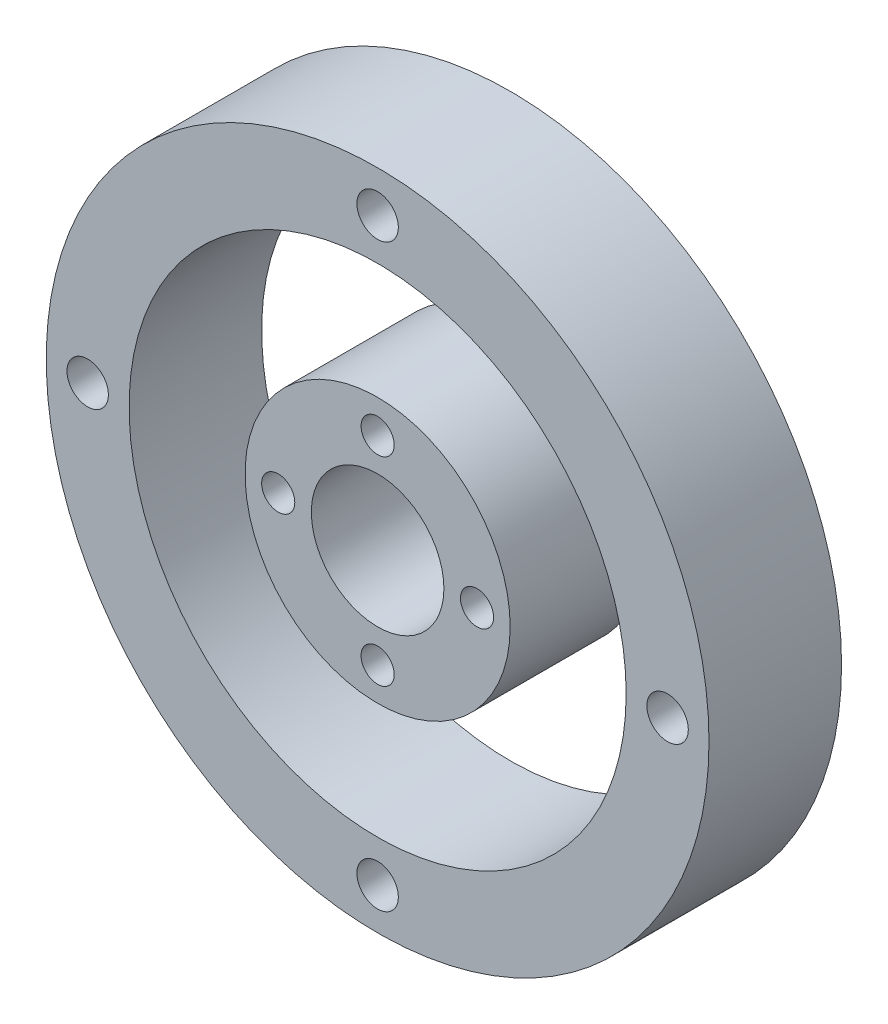
ISO-10303-21;
HEADER;
FILE_DESCRIPTION(('STEP AP214'),'2;1');
FILE_NAME('part.step','',(''),(''),'','','');
FILE_SCHEMA(('AUTOMOTIVE_DESIGN { 1 0 10303 214 1 1 1 1 }'));
ENDSEC;
DATA;
#1=APPLICATION_CONTEXT('core data for automotive mechanical design processes');
#2=APPLICATION_PROTOCOL_DEFINITION('international standard','automotive_design',2000,#1);
#3=PRODUCT_CONTEXT('',#1,'mechanical');
#4=PRODUCT('Part','Part','',(#3));
#5=PRODUCT_RELATED_PRODUCT_CATEGORY('part','',(#4));
#6=PRODUCT_DEFINITION_FORMATION('','',#4);
#7=PRODUCT_DEFINITION_CONTEXT('part definition',#1,'design');
#8=PRODUCT_DEFINITION('design','',#6,#7);
#9=PRODUCT_DEFINITION_SHAPE('','',#8);
#10=(LENGTH_UNIT() NAMED_UNIT(*) SI_UNIT(.MILLI.,.METRE.));
#11=(NAMED_UNIT(*) PLANE_ANGLE_UNIT() SI_UNIT($,.RADIAN.));
#12=(NAMED_UNIT(*) SI_UNIT($,.STERADIAN.) SOLID_ANGLE_UNIT());
#13=UNCERTAINTY_MEASURE_WITH_UNIT(LENGTH_MEASURE(1.E-05),#10,'distance_accuracy_value','');
#14=(GEOMETRIC_REPRESENTATION_CONTEXT(3) GLOBAL_UNCERTAINTY_ASSIGNED_CONTEXT((#13)) GLOBAL_UNIT_ASSIGNED_CONTEXT((#10,
#11,#12)) REPRESENTATION_CONTEXT('',''));
#15=CARTESIAN_POINT('',(0.,0.,0.));
#16=DIRECTION('',(0.,0.,1.));
#17=DIRECTION('',(1.,0.,0.));
#18=AXIS2_PLACEMENT_3D('',#15,#16,#17);
#19=CARTESIAN_POINT('',(0.,0.,8.));
#20=DIRECTION('',(0.,0.,-1.));
#21=DIRECTION('',(-1.,0.,0.));
#22=AXIS2_PLACEMENT_3D('',#19,#20,#21);
#23=CYLINDRICAL_SURFACE('',#22,4.);
#24=CARTESIAN_POINT('',(0.,0.,8.));
#25=DIRECTION('',(0.,0.,1.));
#26=DIRECTION('',(1.,0.,0.));
#27=AXIS2_PLACEMENT_3D('',#24,#25,#26);
#28=CIRCLE('',#27,4.);
#29=CARTESIAN_POINT('',(4.,0.,8.));
#30=VERTEX_POINT('',#29);
#31=EDGE_CURVE('E56',#30,#30,#28,.T.);
#32=ORIENTED_EDGE('',*,*,#31,.T.);
#33=EDGE_LOOP('',(#32));
#34=FACE_BOUND('',#33,.T.);
#35=CARTESIAN_POINT('',(0.,0.,0.));
#36=DIRECTION('',(0.,0.,1.));
#37=DIRECTION('',(1.,0.,0.));
#38=AXIS2_PLACEMENT_3D('',#35,#36,#37);
#39=CIRCLE('',#38,4.);
#40=CARTESIAN_POINT('',(4.,0.,0.));
#41=VERTEX_POINT('',#40);
#42=EDGE_CURVE('E76',#41,#41,#39,.T.);
#43=ORIENTED_EDGE('',*,*,#42,.F.);
#44=EDGE_LOOP('',(#43));
#45=FACE_BOUND('',#44,.T.);
#46=ADVANCED_FACE('F48',(#34,#45),#23,.F.);
#47=CARTESIAN_POINT('',(0.,6.,8.));
#48=DIRECTION('',(0.,0.,-1.));
#49=DIRECTION('',(-1.,0.,0.));
#50=AXIS2_PLACEMENT_3D('',#47,#48,#49);
#51=CYLINDRICAL_SURFACE('',#50,1.);
#52=CARTESIAN_POINT('',(0.,6.,8.));
#53=DIRECTION('',(0.,0.,1.));
#54=DIRECTION('',(1.,0.,0.));
#55=AXIS2_PLACEMENT_3D('',#52,#53,#54);
#56=CIRCLE('',#55,1.);
#57=CARTESIAN_POINT('',(1.,6.,8.));
#58=VERTEX_POINT('',#57);
#59=EDGE_CURVE('E61',#58,#58,#56,.T.);
#60=ORIENTED_EDGE('',*,*,#59,.T.);
#61=EDGE_LOOP('',(#60));
#62=FACE_BOUND('',#61,.T.);
#63=CARTESIAN_POINT('',(0.,6.,0.));
#64=DIRECTION('',(0.,0.,1.));
#65=DIRECTION('',(1.,0.,0.));
#66=AXIS2_PLACEMENT_3D('',#63,#64,#65);
#67=CIRCLE('',#66,1.);
#68=CARTESIAN_POINT('',(1.,6.,0.));
#69=VERTEX_POINT('',#68);
#70=EDGE_CURVE('E74',#69,#69,#67,.T.);
#71=ORIENTED_EDGE('',*,*,#70,.F.);
#72=EDGE_LOOP('',(#71));
#73=FACE_BOUND('',#72,.T.);
#74=ADVANCED_FACE('F97',(#62,#73),#51,.F.);
#75=CARTESIAN_POINT('',(6.,0.,8.));
#76=DIRECTION('',(0.,0.,-1.));
#77=DIRECTION('',(-1.,0.,0.));
#78=AXIS2_PLACEMENT_3D('',#75,#76,#77);
#79=CYLINDRICAL_SURFACE('',#78,1.);
#80=CARTESIAN_POINT('',(6.,0.,8.));
#81=DIRECTION('',(0.,0.,1.));
#82=DIRECTION('',(1.,0.,0.));
#83=AXIS2_PLACEMENT_3D('',#80,#81,#82);
#84=CIRCLE('',#83,1.);
#85=CARTESIAN_POINT('',(7.,0.,8.));
#86=VERTEX_POINT('',#85);
#87=EDGE_CURVE('E90',#86,#86,#84,.T.);
#88=ORIENTED_EDGE('',*,*,#87,.T.);
#89=EDGE_LOOP('',(#88));
#90=FACE_BOUND('',#89,.T.);
#91=CARTESIAN_POINT('',(6.,0.,0.));
#92=DIRECTION('',(0.,0.,1.));
#93=DIRECTION('',(1.,0.,0.));
#94=AXIS2_PLACEMENT_3D('',#91,#92,#93);
#95=CIRCLE('',#94,1.);
#96=CARTESIAN_POINT('',(7.,0.,0.));
#97=VERTEX_POINT('',#96);
#98=EDGE_CURVE('E71',#97,#97,#95,.T.);
#99=ORIENTED_EDGE('',*,*,#98,.F.);
#100=EDGE_LOOP('',(#99));
#101=FACE_BOUND('',#100,.T.);
#102=ADVANCED_FACE('F115',(#90,#101),#79,.F.);
#103=CARTESIAN_POINT('',(0.,-6.,8.));
#104=DIRECTION('',(0.,0.,-1.));
#105=DIRECTION('',(-1.,0.,0.));
#106=AXIS2_PLACEMENT_3D('',#103,#104,#105);
#107=CYLINDRICAL_SURFACE('',#106,1.);
#108=CARTESIAN_POINT('',(0.,-6.,8.));
#109=DIRECTION('',(0.,0.,1.));
#110=DIRECTION('',(1.,0.,0.));
#111=AXIS2_PLACEMENT_3D('',#108,#109,#110);
#112=CIRCLE('',#111,1.);
#113=CARTESIAN_POINT('',(0.999999999999958,-6.,8.));
#114=VERTEX_POINT('',#113);
#115=EDGE_CURVE('E85',#114,#114,#112,.T.);
#116=ORIENTED_EDGE('',*,*,#115,.T.);
#117=EDGE_LOOP('',(#116));
#118=FACE_BOUND('',#117,.T.);
#119=CARTESIAN_POINT('',(0.,-6.,0.));
#120=DIRECTION('',(0.,0.,1.));
#121=DIRECTION('',(1.,0.,0.));
#122=AXIS2_PLACEMENT_3D('',#119,#120,#121);
#123=CIRCLE('',#122,1.);
#124=CARTESIAN_POINT('',(0.999999999999958,-6.,0.));
#125=VERTEX_POINT('',#124);
#126=EDGE_CURVE('E68',#125,#125,#123,.T.);
#127=ORIENTED_EDGE('',*,*,#126,.F.);
#128=EDGE_LOOP('',(#127));
#129=FACE_BOUND('',#128,.T.);
#130=ADVANCED_FACE('F121',(#118,#129),#107,.F.);
#131=CARTESIAN_POINT('',(-6.,0.,8.));
#132=DIRECTION('',(0.,0.,-1.));
#133=DIRECTION('',(-1.,0.,0.));
#134=AXIS2_PLACEMENT_3D('',#131,#132,#133);
#135=CYLINDRICAL_SURFACE('',#134,1.);
#136=CARTESIAN_POINT('',(-6.,0.,8.));
#137=DIRECTION('',(0.,0.,1.));
#138=DIRECTION('',(1.,0.,0.));
#139=AXIS2_PLACEMENT_3D('',#136,#137,#138);
#140=CIRCLE('',#139,1.);
#141=CARTESIAN_POINT('',(-5.,0.,8.));
#142=VERTEX_POINT('',#141);
#143=EDGE_CURVE('E81',#142,#142,#140,.T.);
#144=ORIENTED_EDGE('',*,*,#143,.T.);
#145=EDGE_LOOP('',(#144));
#146=FACE_BOUND('',#145,.T.);
#147=CARTESIAN_POINT('',(-6.,0.,0.));
#148=DIRECTION('',(0.,0.,1.));
#149=DIRECTION('',(1.,0.,0.));
#150=AXIS2_PLACEMENT_3D('',#147,#148,#149);
#151=CIRCLE('',#150,1.);
#152=CARTESIAN_POINT('',(-5.,0.,0.));
#153=VERTEX_POINT('',#152);
#154=EDGE_CURVE('E65',#153,#153,#151,.T.);
#155=ORIENTED_EDGE('',*,*,#154,.F.);
#156=EDGE_LOOP('',(#155));
#157=FACE_BOUND('',#156,.T.);
#158=ADVANCED_FACE('F50',(#146,#157),#135,.F.);
#159=CARTESIAN_POINT('',(0.,0.,8.));
#160=DIRECTION('',(0.,0.,-1.));
#161=DIRECTION('',(-1.,0.,0.));
#162=AXIS2_PLACEMENT_3D('',#159,#160,#161);
#163=CYLINDRICAL_SURFACE('',#162,8.);
#164=CARTESIAN_POINT('',(0.,0.,8.));
#165=DIRECTION('',(0.,0.,1.));
#166=DIRECTION('',(1.,0.,0.));
#167=AXIS2_PLACEMENT_3D('',#164,#165,#166);
#168=CIRCLE('',#167,8.);
#169=CARTESIAN_POINT('',(8.,0.,8.));
#170=VERTEX_POINT('',#169);
#171=EDGE_CURVE('E12',#170,#170,#168,.T.);
#172=ORIENTED_EDGE('',*,*,#171,.F.);
#173=EDGE_LOOP('',(#172));
#174=FACE_BOUND('',#173,.T.);
#175=CARTESIAN_POINT('',(0.,0.,0.));
#176=DIRECTION('',(0.,0.,1.));
#177=DIRECTION('',(1.,0.,0.));
#178=AXIS2_PLACEMENT_3D('',#175,#176,#177);
#179=CIRCLE('',#178,8.);
#180=CARTESIAN_POINT('',(8.,0.,0.));
#181=VERTEX_POINT('',#180);
#182=EDGE_CURVE('E52',#181,#181,#179,.T.);
#183=ORIENTED_EDGE('',*,*,#182,.T.);
#184=EDGE_LOOP('',(#183));
#185=FACE_BOUND('',#184,.T.);
#186=ADVANCED_FACE('F104',(#174,#185),#163,.T.);
#187=CARTESIAN_POINT('',(0.,0.,8.));
#188=DIRECTION('',(0.,0.,1.));
#189=DIRECTION('',(1.,0.,0.));
#190=AXIS2_PLACEMENT_3D('',#187,#188,#189);
#191=PLANE('',#190);
#192=ORIENTED_EDGE('',*,*,#143,.F.);
#193=EDGE_LOOP('',(#192));
#194=FACE_BOUND('',#193,.T.);
#195=ORIENTED_EDGE('',*,*,#115,.F.);
#196=EDGE_LOOP('',(#195));
#197=FACE_BOUND('',#196,.T.);
#198=ORIENTED_EDGE('',*,*,#87,.F.);
#199=EDGE_LOOP('',(#198));
#200=FACE_BOUND('',#199,.T.);
#201=ORIENTED_EDGE('',*,*,#59,.F.);
#202=EDGE_LOOP('',(#201));
#203=FACE_BOUND('',#202,.T.);
#204=ORIENTED_EDGE('',*,*,#31,.F.);
#205=EDGE_LOOP('',(#204));
#206=FACE_BOUND('',#205,.T.);
#207=ORIENTED_EDGE('',*,*,#171,.T.);
#208=EDGE_LOOP('',(#207));
#209=FACE_BOUND('',#208,.T.);
#210=ADVANCED_FACE('F100',(#194,#197,#200,#203,#206,#209),#191,.T.);
#211=CARTESIAN_POINT('',(0.,0.,0.));
#212=DIRECTION('',(0.,0.,1.));
#213=DIRECTION('',(1.,0.,0.));
#214=AXIS2_PLACEMENT_3D('',#211,#212,#213);
#215=PLANE('',#214);
#216=ORIENTED_EDGE('',*,*,#154,.T.);
#217=EDGE_LOOP('',(#216));
#218=FACE_BOUND('',#217,.T.);
#219=ORIENTED_EDGE('',*,*,#126,.T.);
#220=EDGE_LOOP('',(#219));
#221=FACE_BOUND('',#220,.T.);
#222=ORIENTED_EDGE('',*,*,#98,.T.);
#223=EDGE_LOOP('',(#222));
#224=FACE_BOUND('',#223,.T.);
#225=ORIENTED_EDGE('',*,*,#70,.T.);
#226=EDGE_LOOP('',(#225));
#227=FACE_BOUND('',#226,.T.);
#228=ORIENTED_EDGE('',*,*,#42,.T.);
#229=EDGE_LOOP('',(#228));
#230=FACE_BOUND('',#229,.T.);
#231=ORIENTED_EDGE('',*,*,#182,.F.);
#232=EDGE_LOOP('',(#231));
#233=FACE_BOUND('',#232,.T.);
#234=ADVANCED_FACE('F103',(#218,#221,#224,#227,#230,#233),#215,.F.);
#235=CLOSED_SHELL('',(#46,#74,#102,#130,#158,#186,#210,#234));
#236=MANIFOLD_SOLID_BREP('B2',#235);
#237=CARTESIAN_POINT('',(0.,17.5,8.));
#238=DIRECTION('',(0.,0.,-1.));
#239=DIRECTION('',(-1.,0.,0.));
#240=AXIS2_PLACEMENT_3D('',#237,#238,#239);
#241=CYLINDRICAL_SURFACE('',#240,1.25);
#242=CARTESIAN_POINT('',(0.,17.5,8.));
#243=DIRECTION('',(0.,0.,1.));
#244=DIRECTION('',(1.,0.,0.));
#245=AXIS2_PLACEMENT_3D('',#242,#243,#244);
#246=CIRCLE('',#245,1.25);
#247=CARTESIAN_POINT('',(1.25,17.5,8.));
#248=VERTEX_POINT('',#247);
#249=EDGE_CURVE('E201',#248,#248,#246,.T.);
#250=ORIENTED_EDGE('',*,*,#249,.T.);
#251=EDGE_LOOP('',(#250));
#252=FACE_BOUND('',#251,.T.);
#253=CARTESIAN_POINT('',(0.,17.5,0.));
#254=DIRECTION('',(0.,0.,1.));
#255=DIRECTION('',(1.,0.,0.));
#256=AXIS2_PLACEMENT_3D('',#253,#254,#255);
#257=CIRCLE('',#256,1.25);
#258=CARTESIAN_POINT('',(1.25,17.5,0.));
#259=VERTEX_POINT('',#258);
#260=EDGE_CURVE('E221',#259,#259,#257,.T.);
#261=ORIENTED_EDGE('',*,*,#260,.F.);
#262=EDGE_LOOP('',(#261));
#263=FACE_BOUND('',#262,.T.);
#264=ADVANCED_FACE('F193',(#252,#263),#241,.F.);
#265=CARTESIAN_POINT('',(17.5000000000005,4.80076827149021E-13,8.));
#266=DIRECTION('',(0.,0.,-1.));
#267=DIRECTION('',(-1.,0.,0.));
#268=AXIS2_PLACEMENT_3D('',#265,#266,#267);
#269=CYLINDRICAL_SURFACE('',#268,1.25);
#270=CARTESIAN_POINT('',(17.5000000000005,4.80076827149021E-13,8.));
#271=DIRECTION('',(0.,0.,1.));
#272=DIRECTION('',(1.,0.,0.));
#273=AXIS2_PLACEMENT_3D('',#270,#271,#272);
#274=CIRCLE('',#273,1.25);
#275=CARTESIAN_POINT('',(18.7500000000005,4.80076827149021E-13,8.));
#276=VERTEX_POINT('',#275);
#277=EDGE_CURVE('E206',#276,#276,#274,.T.);
#278=ORIENTED_EDGE('',*,*,#277,.T.);
#279=EDGE_LOOP('',(#278));
#280=FACE_BOUND('',#279,.T.);
#281=CARTESIAN_POINT('',(17.5000000000005,4.80076827149021E-13,0.));
#282=DIRECTION('',(0.,0.,1.));
#283=DIRECTION('',(1.,0.,0.));
#284=AXIS2_PLACEMENT_3D('',#281,#282,#283);
#285=CIRCLE('',#284,1.25);
#286=CARTESIAN_POINT('',(18.7500000000005,4.80076827149021E-13,0.));
#287=VERTEX_POINT('',#286);
#288=EDGE_CURVE('E219',#287,#287,#285,.T.);
#289=ORIENTED_EDGE('',*,*,#288,.F.);
#290=EDGE_LOOP('',(#289));
#291=FACE_BOUND('',#290,.T.);
#292=ADVANCED_FACE('F242',(#280,#291),#269,.F.);
#293=CARTESIAN_POINT('',(9.60153654298042E-13,-17.5,8.));
#294=DIRECTION('',(0.,0.,-1.));
#295=DIRECTION('',(-1.,0.,0.));
#296=AXIS2_PLACEMENT_3D('',#293,#294,#295);
#297=CYLINDRICAL_SURFACE('',#296,1.25);
#298=CARTESIAN_POINT('',(9.60153654298042E-13,-17.5,8.));
#299=DIRECTION('',(0.,0.,1.));
#300=DIRECTION('',(1.,0.,0.));
#301=AXIS2_PLACEMENT_3D('',#298,#299,#300);
#302=CIRCLE('',#301,1.25);
#303=CARTESIAN_POINT('',(1.25000000000096,-17.5,8.));
#304=VERTEX_POINT('',#303);
#305=EDGE_CURVE('E235',#304,#304,#302,.T.);
#306=ORIENTED_EDGE('',*,*,#305,.T.);
#307=EDGE_LOOP('',(#306));
#308=FACE_BOUND('',#307,.T.);
#309=CARTESIAN_POINT('',(9.60153654298042E-13,-17.5,0.));
#310=DIRECTION('',(0.,0.,1.));
#311=DIRECTION('',(1.,0.,0.));
#312=AXIS2_PLACEMENT_3D('',#309,#310,#311);
#313=CIRCLE('',#312,1.25);
#314=CARTESIAN_POINT('',(1.25000000000096,-17.5,0.));
#315=VERTEX_POINT('',#314);
#316=EDGE_CURVE('E216',#315,#315,#313,.T.);
#317=ORIENTED_EDGE('',*,*,#316,.F.);
#318=EDGE_LOOP('',(#317));
#319=FACE_BOUND('',#318,.T.);
#320=ADVANCED_FACE('F260',(#308,#319),#297,.F.);
#321=CARTESIAN_POINT('',(-17.4999999999995,-4.82219959047529E-13,8.));
#322=DIRECTION('',(0.,0.,-1.));
#323=DIRECTION('',(-1.,0.,0.));
#324=AXIS2_PLACEMENT_3D('',#321,#322,#323);
#325=CYLINDRICAL_SURFACE('',#324,1.25);
#326=CARTESIAN_POINT('',(-17.4999999999995,-4.82219959047529E-13,8.));
#327=DIRECTION('',(0.,0.,1.));
#328=DIRECTION('',(1.,0.,0.));
#329=AXIS2_PLACEMENT_3D('',#326,#327,#328);
#330=CIRCLE('',#329,1.25);
#331=CARTESIAN_POINT('',(-16.2499999999995,-4.82219959047529E-13,8.));
#332=VERTEX_POINT('',#331);
#333=EDGE_CURVE('E230',#332,#332,#330,.T.);
#334=ORIENTED_EDGE('',*,*,#333,.T.);
#335=EDGE_LOOP('',(#334));
#336=FACE_BOUND('',#335,.T.);
#337=CARTESIAN_POINT('',(-17.4999999999995,-4.82219959047529E-13,0.));
#338=DIRECTION('',(0.,0.,1.));
#339=DIRECTION('',(1.,0.,0.));
#340=AXIS2_PLACEMENT_3D('',#337,#338,#339);
#341=CIRCLE('',#340,1.25);
#342=CARTESIAN_POINT('',(-16.2499999999995,-4.82219959047529E-13,0.));
#343=VERTEX_POINT('',#342);
#344=EDGE_CURVE('E213',#343,#343,#341,.T.);
#345=ORIENTED_EDGE('',*,*,#344,.F.);
#346=EDGE_LOOP('',(#345));
#347=FACE_BOUND('',#346,.T.);
#348=ADVANCED_FACE('F266',(#336,#347),#325,.F.);
#349=CARTESIAN_POINT('',(0.,0.,8.));
#350=DIRECTION('',(0.,0.,-1.));
#351=DIRECTION('',(-1.,0.,0.));
#352=AXIS2_PLACEMENT_3D('',#349,#350,#351);
#353=CYLINDRICAL_SURFACE('',#352,15.);
#354=CARTESIAN_POINT('',(0.,0.,8.));
#355=DIRECTION('',(0.,0.,1.));
#356=DIRECTION('',(1.,0.,0.));
#357=AXIS2_PLACEMENT_3D('',#354,#355,#356);
#358=CIRCLE('',#357,15.);
#359=CARTESIAN_POINT('',(15.,0.,8.));
#360=VERTEX_POINT('',#359);
#361=EDGE_CURVE('E226',#360,#360,#358,.T.);
#362=ORIENTED_EDGE('',*,*,#361,.T.);
#363=EDGE_LOOP('',(#362));
#364=FACE_BOUND('',#363,.T.);
#365=CARTESIAN_POINT('',(0.,0.,0.));
#366=DIRECTION('',(0.,0.,1.));
#367=DIRECTION('',(1.,0.,0.));
#368=AXIS2_PLACEMENT_3D('',#365,#366,#367);
#369=CIRCLE('',#368,15.);
#370=CARTESIAN_POINT('',(15.,0.,0.));
#371=VERTEX_POINT('',#370);
#372=EDGE_CURVE('E210',#371,#371,#369,.T.);
#373=ORIENTED_EDGE('',*,*,#372,.F.);
#374=EDGE_LOOP('',(#373));
#375=FACE_BOUND('',#374,.T.);
#376=ADVANCED_FACE('F195',(#364,#375),#353,.F.);
#377=CARTESIAN_POINT('',(0.,0.,8.));
#378=DIRECTION('',(0.,0.,-1.));
#379=DIRECTION('',(-1.,0.,0.));
#380=AXIS2_PLACEMENT_3D('',#377,#378,#379);
#381=CYLINDRICAL_SURFACE('',#380,20.);
#382=CARTESIAN_POINT('',(0.,0.,8.));
#383=DIRECTION('',(0.,0.,1.));
#384=DIRECTION('',(1.,0.,0.));
#385=AXIS2_PLACEMENT_3D('',#382,#383,#384);
#386=CIRCLE('',#385,20.);
#387=CARTESIAN_POINT('',(20.,0.,8.));
#388=VERTEX_POINT('',#387);
#389=EDGE_CURVE('E47',#388,#388,#386,.T.);
#390=ORIENTED_EDGE('',*,*,#389,.F.);
#391=EDGE_LOOP('',(#390));
#392=FACE_BOUND('',#391,.T.);
#393=CARTESIAN_POINT('',(0.,0.,0.));
#394=DIRECTION('',(0.,0.,1.));
#395=DIRECTION('',(1.,0.,0.));
#396=AXIS2_PLACEMENT_3D('',#393,#394,#395);
#397=CIRCLE('',#396,20.);
#398=CARTESIAN_POINT('',(20.,0.,0.));
#399=VERTEX_POINT('',#398);
#400=EDGE_CURVE('E197',#399,#399,#397,.T.);
#401=ORIENTED_EDGE('',*,*,#400,.T.);
#402=EDGE_LOOP('',(#401));
#403=FACE_BOUND('',#402,.T.);
#404=ADVANCED_FACE('F249',(#392,#403),#381,.T.);
#405=CARTESIAN_POINT('',(0.,0.,8.));
#406=DIRECTION('',(0.,0.,1.));
#407=DIRECTION('',(1.,0.,0.));
#408=AXIS2_PLACEMENT_3D('',#405,#406,#407);
#409=PLANE('',#408);
#410=ORIENTED_EDGE('',*,*,#361,.F.);
#411=EDGE_LOOP('',(#410));
#412=FACE_BOUND('',#411,.T.);
#413=ORIENTED_EDGE('',*,*,#333,.F.);
#414=EDGE_LOOP('',(#413));
#415=FACE_BOUND('',#414,.T.);
#416=ORIENTED_EDGE('',*,*,#305,.F.);
#417=EDGE_LOOP('',(#416));
#418=FACE_BOUND('',#417,.T.);
#419=ORIENTED_EDGE('',*,*,#277,.F.);
#420=EDGE_LOOP('',(#419));
#421=FACE_BOUND('',#420,.T.);
#422=ORIENTED_EDGE('',*,*,#249,.F.);
#423=EDGE_LOOP('',(#422));
#424=FACE_BOUND('',#423,.T.);
#425=ORIENTED_EDGE('',*,*,#389,.T.);
#426=EDGE_LOOP('',(#425));
#427=FACE_BOUND('',#426,.T.);
#428=ADVANCED_FACE('F245',(#412,#415,#418,#421,#424,#427),#409,.T.);
#429=CARTESIAN_POINT('',(0.,0.,0.));
#430=DIRECTION('',(0.,0.,1.));
#431=DIRECTION('',(1.,0.,0.));
#432=AXIS2_PLACEMENT_3D('',#429,#430,#431);
#433=PLANE('',#432);
#434=ORIENTED_EDGE('',*,*,#372,.T.);
#435=EDGE_LOOP('',(#434));
#436=FACE_BOUND('',#435,.T.);
#437=ORIENTED_EDGE('',*,*,#344,.T.);
#438=EDGE_LOOP('',(#437));
#439=FACE_BOUND('',#438,.T.);
#440=ORIENTED_EDGE('',*,*,#316,.T.);
#441=EDGE_LOOP('',(#440));
#442=FACE_BOUND('',#441,.T.);
#443=ORIENTED_EDGE('',*,*,#288,.T.);
#444=EDGE_LOOP('',(#443));
#445=FACE_BOUND('',#444,.T.);
#446=ORIENTED_EDGE('',*,*,#260,.T.);
#447=EDGE_LOOP('',(#446));
#448=FACE_BOUND('',#447,.T.);
#449=ORIENTED_EDGE('',*,*,#400,.F.);
#450=EDGE_LOOP('',(#449));
#451=FACE_BOUND('',#450,.T.);
#452=ADVANCED_FACE('F248',(#436,#439,#442,#445,#448,#451),#433,.F.);
#453=CLOSED_SHELL('',(#264,#292,#320,#348,#376,#404,#428,#452));
#454=MANIFOLD_SOLID_BREP('B7',#453);
#455=ADVANCED_BREP_SHAPE_REPRESENTATION('',(#18,#236,#454),#14);
#456=SHAPE_DEFINITION_REPRESENTATION(#9,#455);
ENDSEC;
END-ISO-10303-21;
